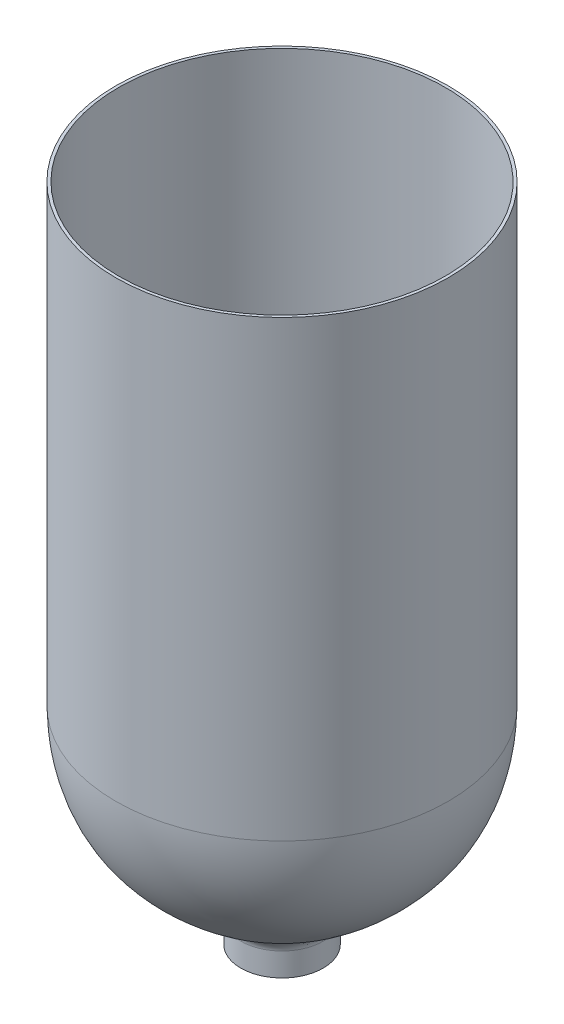
ISO-10303-21;
HEADER;
FILE_DESCRIPTION(('STEP AP214'),'2;1');
FILE_NAME('part.step','',(''),(''),'','','');
FILE_SCHEMA(('AUTOMOTIVE_DESIGN { 1 0 10303 214 1 1 1 1 }'));
ENDSEC;
DATA;
#1=APPLICATION_CONTEXT('core data for automotive mechanical design processes');
#2=APPLICATION_PROTOCOL_DEFINITION('international standard','automotive_design',2000,#1);
#3=PRODUCT_CONTEXT('',#1,'mechanical');
#4=PRODUCT('Part','Part','',(#3));
#5=PRODUCT_RELATED_PRODUCT_CATEGORY('part','',(#4));
#6=PRODUCT_DEFINITION_FORMATION('','',#4);
#7=PRODUCT_DEFINITION_CONTEXT('part definition',#1,'design');
#8=PRODUCT_DEFINITION('design','',#6,#7);
#9=PRODUCT_DEFINITION_SHAPE('','',#8);
#10=(LENGTH_UNIT() NAMED_UNIT(*) SI_UNIT(.MILLI.,.METRE.));
#11=(NAMED_UNIT(*) PLANE_ANGLE_UNIT() SI_UNIT($,.RADIAN.));
#12=(NAMED_UNIT(*) SI_UNIT($,.STERADIAN.) SOLID_ANGLE_UNIT());
#13=UNCERTAINTY_MEASURE_WITH_UNIT(LENGTH_MEASURE(1.E-05),#10,'distance_accuracy_value','');
#14=(GEOMETRIC_REPRESENTATION_CONTEXT(3) GLOBAL_UNCERTAINTY_ASSIGNED_CONTEXT((#13)) GLOBAL_UNIT_ASSIGNED_CONTEXT((#10,
#11,#12)) REPRESENTATION_CONTEXT('',''));
#15=CARTESIAN_POINT('',(0.,0.,0.));
#16=DIRECTION('',(0.,0.,1.));
#17=DIRECTION('',(1.,0.,0.));
#18=AXIS2_PLACEMENT_3D('',#15,#16,#17);
#19=CARTESIAN_POINT('',(-55.88,118.459427374302,0.));
#20=DIRECTION('',(0.,1.,0.));
#21=DIRECTION('',(0.,0.,1.));
#22=AXIS2_PLACEMENT_3D('',#19,#20,#21);
#23=PLANE('',#22);
#24=CARTESIAN_POINT('',(0.,118.459427374302,0.));
#25=DIRECTION('',(0.,1.,0.));
#26=DIRECTION('',(0.,0.,1.));
#27=AXIS2_PLACEMENT_3D('',#24,#25,#26);
#28=CIRCLE('',#27,55.88);
#29=CARTESIAN_POINT('',(0.,118.459427374302,55.88));
#30=VERTEX_POINT('',#29);
#31=EDGE_CURVE('E68',#30,#30,#28,.T.);
#32=ORIENTED_EDGE('',*,*,#31,.T.);
#33=EDGE_LOOP('',(#32));
#34=FACE_BOUND('',#33,.T.);
#35=CARTESIAN_POINT('',(0.,118.459427374302,0.));
#36=DIRECTION('',(0.,1.,0.));
#37=DIRECTION('',(0.,0.,1.));
#38=AXIS2_PLACEMENT_3D('',#35,#36,#37);
#39=CIRCLE('',#38,54.9228647434174);
#40=CARTESIAN_POINT('',(0.,118.459427374302,54.9228647434174));
#41=VERTEX_POINT('',#40);
#42=EDGE_CURVE('E12',#41,#41,#39,.T.);
#43=ORIENTED_EDGE('',*,*,#42,.F.);
#44=EDGE_LOOP('',(#43));
#45=FACE_BOUND('',#44,.T.);
#46=ADVANCED_FACE('F40',(#34,#45),#23,.T.);
#47=CARTESIAN_POINT('',(0.,76.879343575419,0.));
#48=DIRECTION('',(0.,1.,0.));
#49=DIRECTION('',(0.,0.,1.));
#50=AXIS2_PLACEMENT_3D('',#47,#48,#49);
#51=CYLINDRICAL_SURFACE('',#50,54.9228647434174);
#52=ORIENTED_EDGE('',*,*,#42,.T.);
#53=EDGE_LOOP('',(#52));
#54=FACE_BOUND('',#53,.T.);
#55=CARTESIAN_POINT('',(0.,-33.4826660237046,0.));
#56=DIRECTION('',(0.,1.,0.));
#57=DIRECTION('',(0.,0.,1.));
#58=AXIS2_PLACEMENT_3D('',#55,#56,#57);
#59=CIRCLE('',#58,54.9228647434174);
#60=CARTESIAN_POINT('',(0.,-33.4826660237046,54.9228647434174));
#61=VERTEX_POINT('',#60);
#62=EDGE_CURVE('E46',#61,#61,#59,.T.);
#63=ORIENTED_EDGE('',*,*,#62,.F.);
#64=EDGE_LOOP('',(#63));
#65=FACE_BOUND('',#64,.T.);
#66=ADVANCED_FACE('F86',(#54,#65),#51,.F.);
#67=CARTESIAN_POINT('',(-12.8896811136351,-95.6807386494029,0.));
#68=CARTESIAN_POINT('',(-12.3545699026582,-85.610371161275,0.));
#69=CARTESIAN_POINT('',(-54.0196553440791,-80.3381476144266,0.));
#70=CARTESIAN_POINT('',(-54.9228647434174,-33.4826660237046,0.));
#71=B_SPLINE_CURVE_WITH_KNOTS('',3,(#67,#68,#69,#70),.UNSPECIFIED.,.F.,.F.,(4,4),(0.,1.),.UNSPECIFIED.);
#72=CARTESIAN_POINT('',(0.,76.879343575419,0.));
#73=DIRECTION('',(0.,1.,0.));
#74=AXIS1_PLACEMENT('',#72,#73);
#75=SURFACE_OF_REVOLUTION('',#71,#74);
#76=ORIENTED_EDGE('',*,*,#62,.T.);
#77=EDGE_LOOP('',(#76));
#78=FACE_BOUND('',#77,.T.);
#79=CARTESIAN_POINT('',(0.,-95.6807386494029,0.));
#80=DIRECTION('',(0.,1.,0.));
#81=DIRECTION('',(0.,0.,1.));
#82=AXIS2_PLACEMENT_3D('',#79,#80,#81);
#83=CIRCLE('',#82,12.8896811136351);
#84=CARTESIAN_POINT('',(0.,-95.6807386494029,12.8896811136351));
#85=VERTEX_POINT('',#84);
#86=EDGE_CURVE('E50',#85,#85,#83,.T.);
#87=ORIENTED_EDGE('',*,*,#86,.F.);
#88=EDGE_LOOP('',(#87));
#89=FACE_BOUND('',#88,.T.);
#90=ADVANCED_FACE('F82',(#78,#89),#75,.F.);
#91=CARTESIAN_POINT('',(0.,76.879343575419,0.));
#92=DIRECTION('',(0.,1.,0.));
#93=DIRECTION('',(0.,0.,1.));
#94=AXIS2_PLACEMENT_3D('',#91,#92,#93);
#95=CYLINDRICAL_SURFACE('',#94,12.8896811136351);
#96=ORIENTED_EDGE('',*,*,#86,.T.);
#97=EDGE_LOOP('',(#96));
#98=FACE_BOUND('',#97,.T.);
#99=CARTESIAN_POINT('',(0.,-103.521086549933,0.));
#100=DIRECTION('',(0.,1.,0.));
#101=DIRECTION('',(0.,0.,1.));
#102=AXIS2_PLACEMENT_3D('',#99,#100,#101);
#103=CIRCLE('',#102,12.8896811136351);
#104=CARTESIAN_POINT('',(0.,-103.521086549933,12.8896811136351));
#105=VERTEX_POINT('',#104);
#106=EDGE_CURVE('E54',#105,#105,#103,.T.);
#107=ORIENTED_EDGE('',*,*,#106,.F.);
#108=EDGE_LOOP('',(#107));
#109=FACE_BOUND('',#108,.T.);
#110=ADVANCED_FACE('F85',(#98,#109),#95,.F.);
#111=CARTESIAN_POINT('',(-13.8515106869145,-103.521086549933,0.));
#112=DIRECTION('',(0.,-1.,0.));
#113=DIRECTION('',(0.,0.,-1.));
#114=AXIS2_PLACEMENT_3D('',#111,#112,#113);
#115=PLANE('',#114);
#116=ORIENTED_EDGE('',*,*,#106,.T.);
#117=EDGE_LOOP('',(#116));
#118=FACE_BOUND('',#117,.T.);
#119=CARTESIAN_POINT('',(0.,-103.521086549933,0.));
#120=DIRECTION('',(0.,1.,0.));
#121=DIRECTION('',(0.,0.,1.));
#122=AXIS2_PLACEMENT_3D('',#119,#120,#121);
#123=CIRCLE('',#122,13.8515106869145);
#124=CARTESIAN_POINT('',(0.,-103.521086549933,13.8515106869145));
#125=VERTEX_POINT('',#124);
#126=EDGE_CURVE('E59',#125,#125,#123,.T.);
#127=ORIENTED_EDGE('',*,*,#126,.F.);
#128=EDGE_LOOP('',(#127));
#129=FACE_BOUND('',#128,.T.);
#130=ADVANCED_FACE('F112',(#118,#129),#115,.T.);
#131=CARTESIAN_POINT('',(0.,76.879343575419,0.));
#132=DIRECTION('',(0.,1.,0.));
#133=DIRECTION('',(0.,0.,1.));
#134=AXIS2_PLACEMENT_3D('',#131,#132,#133);
#135=CYLINDRICAL_SURFACE('',#134,13.8515106869145);
#136=ORIENTED_EDGE('',*,*,#126,.T.);
#137=EDGE_LOOP('',(#136));
#138=FACE_BOUND('',#137,.T.);
#139=CARTESIAN_POINT('',(0.,-95.6807386494029,0.));
#140=DIRECTION('',(0.,1.,0.));
#141=DIRECTION('',(0.,0.,1.));
#142=AXIS2_PLACEMENT_3D('',#139,#140,#141);
#143=CIRCLE('',#142,13.8515106869145);
#144=CARTESIAN_POINT('',(0.,-95.6807386494029,13.8515106869145));
#145=VERTEX_POINT('',#144);
#146=EDGE_CURVE('E62',#145,#145,#143,.T.);
#147=ORIENTED_EDGE('',*,*,#146,.F.);
#148=EDGE_LOOP('',(#147));
#149=FACE_BOUND('',#148,.T.);
#150=ADVANCED_FACE('F107',(#138,#149),#135,.T.);
#151=CARTESIAN_POINT('',(-55.88,-33.9405726256983,0.));
#152=CARTESIAN_POINT('',(-54.9905757688338,-80.0809258154248,0.));
#153=CARTESIAN_POINT('',(-14.5740307284184,-85.8976574268542,0.));
#154=CARTESIAN_POINT('',(-13.8515106869145,-95.6807386494029,0.));
#155=B_SPLINE_CURVE_WITH_KNOTS('',3,(#151,#152,#153,#154),.UNSPECIFIED.,.F.,.F.,(4,4),(0.,
0.984737572281466),.UNSPECIFIED.);
#156=CARTESIAN_POINT('',(0.,76.879343575419,0.));
#157=DIRECTION('',(0.,1.,0.));
#158=AXIS1_PLACEMENT('',#156,#157);
#159=SURFACE_OF_REVOLUTION('',#155,#158);
#160=ORIENTED_EDGE('',*,*,#146,.T.);
#161=EDGE_LOOP('',(#160));
#162=FACE_BOUND('',#161,.T.);
#163=CARTESIAN_POINT('',(0.,-33.9405726256983,0.));
#164=DIRECTION('',(0.,1.,0.));
#165=DIRECTION('',(0.,0.,1.));
#166=AXIS2_PLACEMENT_3D('',#163,#164,#165);
#167=CIRCLE('',#166,55.88);
#168=CARTESIAN_POINT('',(0.,-33.9405726256983,55.88));
#169=VERTEX_POINT('',#168);
#170=EDGE_CURVE('E65',#169,#169,#167,.T.);
#171=ORIENTED_EDGE('',*,*,#170,.F.);
#172=EDGE_LOOP('',(#171));
#173=FACE_BOUND('',#172,.T.);
#174=ADVANCED_FACE('F101',(#162,#173),#159,.F.);
#175=CARTESIAN_POINT('',(0.,76.879343575419,0.));
#176=DIRECTION('',(0.,1.,0.));
#177=DIRECTION('',(0.,0.,1.));
#178=AXIS2_PLACEMENT_3D('',#175,#176,#177);
#179=CYLINDRICAL_SURFACE('',#178,55.88);
#180=ORIENTED_EDGE('',*,*,#170,.T.);
#181=EDGE_LOOP('',(#180));
#182=FACE_BOUND('',#181,.T.);
#183=ORIENTED_EDGE('',*,*,#31,.F.);
#184=EDGE_LOOP('',(#183));
#185=FACE_BOUND('',#184,.T.);
#186=ADVANCED_FACE('F99',(#182,#185),#179,.T.);
#187=CLOSED_SHELL('',(#46,#66,#90,#110,#130,#150,#174,#186));
#188=MANIFOLD_SOLID_BREP('B2',#187);
#189=ADVANCED_BREP_SHAPE_REPRESENTATION('',(#18,#188),#14);
#190=SHAPE_DEFINITION_REPRESENTATION(#9,#189);
ENDSEC;
END-ISO-10303-21;
